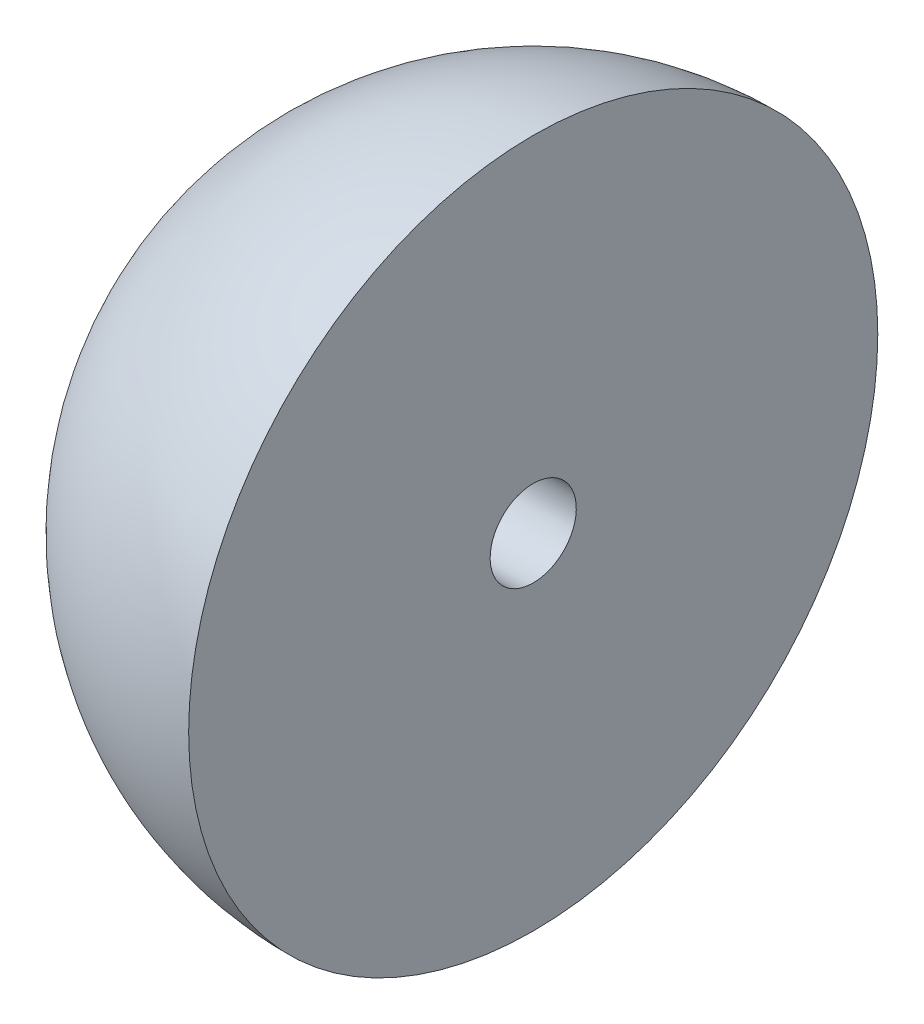
ISO-10303-21;
HEADER;
FILE_DESCRIPTION(('STEP AP214'),'2;1');
FILE_NAME('part.step','',(''),(''),'','','');
FILE_SCHEMA(('AUTOMOTIVE_DESIGN { 1 0 10303 214 1 1 1 1 }'));
ENDSEC;
DATA;
#1=APPLICATION_CONTEXT('core data for automotive mechanical design processes');
#2=APPLICATION_PROTOCOL_DEFINITION('international standard','automotive_design',2000,#1);
#3=PRODUCT_CONTEXT('',#1,'mechanical');
#4=PRODUCT('Part','Part','',(#3));
#5=PRODUCT_RELATED_PRODUCT_CATEGORY('part','',(#4));
#6=PRODUCT_DEFINITION_FORMATION('','',#4);
#7=PRODUCT_DEFINITION_CONTEXT('part definition',#1,'design');
#8=PRODUCT_DEFINITION('design','',#6,#7);
#9=PRODUCT_DEFINITION_SHAPE('','',#8);
#10=(LENGTH_UNIT() NAMED_UNIT(*) SI_UNIT(.MILLI.,.METRE.));
#11=(NAMED_UNIT(*) PLANE_ANGLE_UNIT() SI_UNIT($,.RADIAN.));
#12=(NAMED_UNIT(*) SI_UNIT($,.STERADIAN.) SOLID_ANGLE_UNIT());
#13=UNCERTAINTY_MEASURE_WITH_UNIT(LENGTH_MEASURE(1.E-05),#10,'distance_accuracy_value','');
#14=(GEOMETRIC_REPRESENTATION_CONTEXT(3) GLOBAL_UNCERTAINTY_ASSIGNED_CONTEXT((#13)) GLOBAL_UNIT_ASSIGNED_CONTEXT((#10,
#11,#12)) REPRESENTATION_CONTEXT('',''));
#15=CARTESIAN_POINT('',(0.,0.,0.));
#16=DIRECTION('',(0.,0.,1.));
#17=DIRECTION('',(1.,0.,0.));
#18=AXIS2_PLACEMENT_3D('',#15,#16,#17);
#19=CARTESIAN_POINT('',(0.,0.,0.));
#20=DIRECTION('',(0.,0.,1.));
#21=DIRECTION('',(0.,-1.,0.));
#22=AXIS2_PLACEMENT_3D('',#19,#20,#21);
#23=SPHERICAL_SURFACE('',#22,18.);
#24=CARTESIAN_POINT('',(0.,0.,0.));
#25=DIRECTION('',(-1.,0.,0.));
#26=DIRECTION('',(0.,0.,-1.));
#27=AXIS2_PLACEMENT_3D('',#24,#25,#26);
#28=CIRCLE('',#27,18.);
#29=CARTESIAN_POINT('',(0.,0.,-18.));
#30=VERTEX_POINT('',#29);
#31=EDGE_CURVE('E114',#30,#30,#28,.T.);
#32=ORIENTED_EDGE('',*,*,#31,.T.);
#33=EDGE_LOOP('',(#32));
#34=FACE_BOUND('',#33,.T.);
#35=CARTESIAN_POINT('',(0.,0.,3.5));
#36=DIRECTION('',(0.,0.,-1.));
#37=DIRECTION('',(-1.,0.,0.));
#38=AXIS2_PLACEMENT_3D('',#35,#36,#37);
#39=CIRCLE('',#38,17.6564435830096);
#40=CARTESIAN_POINT('',(-8.64182320352747,-15.3970416547782,3.5));
#41=VERTEX_POINT('',#40);
#42=CARTESIAN_POINT('',(-5.64182320352747,-16.7308048503394,3.5));
#43=VERTEX_POINT('',#42);
#44=EDGE_CURVE('E46',#41,#43,#39,.F.);
#45=ORIENTED_EDGE('',*,*,#44,.T.);
#46=CARTESIAN_POINT('',(-5.64182320352747,0.,0.));
#47=DIRECTION('',(-1.,0.,0.));
#48=DIRECTION('',(0.,0.,1.));
#49=AXIS2_PLACEMENT_3D('',#46,#47,#48);
#50=CIRCLE('',#49,17.0929760703085);
#51=CARTESIAN_POINT('',(-5.64182320352747,-16.7308048503394,-3.5));
#52=VERTEX_POINT('',#51);
#53=EDGE_CURVE('E110',#43,#52,#50,.F.);
#54=ORIENTED_EDGE('',*,*,#53,.T.);
#55=CARTESIAN_POINT('',(0.,0.,-3.5));
#56=DIRECTION('',(0.,0.,1.));
#57=DIRECTION('',(1.,0.,0.));
#58=AXIS2_PLACEMENT_3D('',#55,#56,#57);
#59=CIRCLE('',#58,17.6564435830096);
#60=CARTESIAN_POINT('',(-8.64182320352747,-15.3970416547782,-3.5));
#61=VERTEX_POINT('',#60);
#62=EDGE_CURVE('E11',#52,#61,#59,.F.);
#63=ORIENTED_EDGE('',*,*,#62,.T.);
#64=CARTESIAN_POINT('',(-8.64182320352747,0.,0.));
#65=DIRECTION('',(1.,0.,0.));
#66=DIRECTION('',(0.,0.,-1.));
#67=AXIS2_PLACEMENT_3D('',#64,#65,#66);
#68=CIRCLE('',#67,15.789835075737);
#69=EDGE_CURVE('E98',#61,#41,#68,.F.);
#70=ORIENTED_EDGE('',*,*,#69,.T.);
#71=EDGE_LOOP('',(#45,#54,#63,#70));
#72=FACE_BOUND('',#71,.T.);
#73=ADVANCED_FACE('F39',(#34,#72),#23,.T.);
#74=CARTESIAN_POINT('',(-15.,1.04744440165294E-13,0.));
#75=DIRECTION('',(1.,0.,0.));
#76=DIRECTION('',(0.,1.,0.));
#77=AXIS2_PLACEMENT_3D('',#74,#75,#76);
#78=CYLINDRICAL_SURFACE('',#77,2.25);
#79=CARTESIAN_POINT('',(0.,0.,0.));
#80=DIRECTION('',(1.,0.,0.));
#81=DIRECTION('',(0.,1.,0.));
#82=AXIS2_PLACEMENT_3D('',#79,#80,#81);
#83=CIRCLE('',#82,2.25);
#84=CARTESIAN_POINT('',(0.,2.25,0.));
#85=VERTEX_POINT('',#84);
#86=EDGE_CURVE('E108',#85,#85,#83,.T.);
#87=ORIENTED_EDGE('',*,*,#86,.T.);
#88=EDGE_LOOP('',(#87));
#89=FACE_BOUND('',#88,.T.);
#90=CARTESIAN_POINT('',(-5.64182320352747,0.,0.));
#91=DIRECTION('',(-1.,0.,0.));
#92=DIRECTION('',(0.,0.,1.));
#93=AXIS2_PLACEMENT_3D('',#90,#91,#92);
#94=CIRCLE('',#93,2.25);
#95=CARTESIAN_POINT('',(-5.64182320352747,0.,2.25));
#96=VERTEX_POINT('',#95);
#97=EDGE_CURVE('E106',#96,#96,#94,.F.);
#98=ORIENTED_EDGE('',*,*,#97,.F.);
#99=EDGE_LOOP('',(#98));
#100=FACE_BOUND('',#99,.T.);
#101=ADVANCED_FACE('F136',(#89,#100),#78,.F.);
#102=CARTESIAN_POINT('',(0.,0.,0.));
#103=DIRECTION('',(-1.,0.,0.));
#104=DIRECTION('',(0.,0.,-1.));
#105=AXIS2_PLACEMENT_3D('',#102,#103,#104);
#106=PLANE('',#105);
#107=ORIENTED_EDGE('',*,*,#86,.F.);
#108=EDGE_LOOP('',(#107));
#109=FACE_BOUND('',#108,.T.);
#110=ORIENTED_EDGE('',*,*,#31,.F.);
#111=EDGE_LOOP('',(#110));
#112=FACE_BOUND('',#111,.T.);
#113=ADVANCED_FACE('F149',(#109,#112),#106,.F.);
#114=CARTESIAN_POINT('',(-5.64182320352747,5.,3.5));
#115=DIRECTION('',(-1.,0.,0.));
#116=DIRECTION('',(0.,0.,1.));
#117=AXIS2_PLACEMENT_3D('',#114,#115,#116);
#118=PLANE('',#117);
#119=DIRECTION('',(0.,-1.,0.));
#120=VECTOR('',#119,1.);
#121=CARTESIAN_POINT('',(-5.64182320352747,5.,3.5));
#122=LINE('',#121,#120);
#123=CARTESIAN_POINT('',(-5.64182320352747,5.,3.5));
#124=VERTEX_POINT('',#123);
#125=EDGE_CURVE('E52',#124,#43,#122,.T.);
#126=ORIENTED_EDGE('',*,*,#125,.F.);
#127=DIRECTION('',(0.,0.,-1.));
#128=VECTOR('',#127,1.);
#129=CARTESIAN_POINT('',(-5.64182320352747,5.,3.5));
#130=LINE('',#129,#128);
#131=CARTESIAN_POINT('',(-5.64182320352747,5.,-3.5));
#132=VERTEX_POINT('',#131);
#133=EDGE_CURVE('E82',#124,#132,#130,.T.);
#134=ORIENTED_EDGE('',*,*,#133,.T.);
#135=DIRECTION('',(0.,-1.,0.));
#136=VECTOR('',#135,1.);
#137=CARTESIAN_POINT('',(-5.64182320352747,5.,-3.5));
#138=LINE('',#137,#136);
#139=EDGE_CURVE('E89',#132,#52,#138,.T.);
#140=ORIENTED_EDGE('',*,*,#139,.T.);
#141=ORIENTED_EDGE('',*,*,#53,.F.);
#142=EDGE_LOOP('',(#126,#134,#140,#141));
#143=FACE_BOUND('',#142,.T.);
#144=ORIENTED_EDGE('',*,*,#97,.T.);
#145=EDGE_LOOP('',(#144));
#146=FACE_BOUND('',#145,.T.);
#147=ADVANCED_FACE('F86',(#143,#146),#118,.T.);
#148=CARTESIAN_POINT('',(-8.64182320352747,5.,3.5));
#149=DIRECTION('',(1.,0.,0.));
#150=DIRECTION('',(0.,0.,-1.));
#151=AXIS2_PLACEMENT_3D('',#148,#149,#150);
#152=PLANE('',#151);
#153=DIRECTION('',(0.,-1.,0.));
#154=VECTOR('',#153,1.);
#155=CARTESIAN_POINT('',(-8.64182320352747,5.,-3.5));
#156=LINE('',#155,#154);
#157=CARTESIAN_POINT('',(-8.64182320352747,5.,-3.5));
#158=VERTEX_POINT('',#157);
#159=EDGE_CURVE('E92',#158,#61,#156,.T.);
#160=ORIENTED_EDGE('',*,*,#159,.F.);
#161=DIRECTION('',(0.,0.,1.));
#162=VECTOR('',#161,1.);
#163=CARTESIAN_POINT('',(-8.64182320352747,5.,3.5));
#164=LINE('',#163,#162);
#165=CARTESIAN_POINT('',(-8.64182320352747,5.,3.5));
#166=VERTEX_POINT('',#165);
#167=EDGE_CURVE('E85',#158,#166,#164,.T.);
#168=ORIENTED_EDGE('',*,*,#167,.T.);
#169=DIRECTION('',(0.,-1.,0.));
#170=VECTOR('',#169,1.);
#171=CARTESIAN_POINT('',(-8.64182320352747,5.,3.5));
#172=LINE('',#171,#170);
#173=EDGE_CURVE('E99',#166,#41,#172,.T.);
#174=ORIENTED_EDGE('',*,*,#173,.T.);
#175=ORIENTED_EDGE('',*,*,#69,.F.);
#176=EDGE_LOOP('',(#160,#168,#174,#175));
#177=FACE_BOUND('',#176,.T.);
#178=CARTESIAN_POINT('',(-8.64182320352747,0.,0.));
#179=DIRECTION('',(1.,0.,0.));
#180=DIRECTION('',(0.,0.,-1.));
#181=AXIS2_PLACEMENT_3D('',#178,#179,#180);
#182=CIRCLE('',#181,2.25);
#183=CARTESIAN_POINT('',(-8.64182320352747,0.,-2.25));
#184=VERTEX_POINT('',#183);
#185=EDGE_CURVE('E94',#184,#184,#182,.F.);
#186=ORIENTED_EDGE('',*,*,#185,.T.);
#187=EDGE_LOOP('',(#186));
#188=FACE_BOUND('',#187,.T.);
#189=ADVANCED_FACE('F121',(#177,#188),#152,.T.);
#190=CARTESIAN_POINT('',(-5.64182320352747,5.,-3.5));
#191=DIRECTION('',(0.,0.,1.));
#192=DIRECTION('',(1.,0.,0.));
#193=AXIS2_PLACEMENT_3D('',#190,#191,#192);
#194=PLANE('',#193);
#195=ORIENTED_EDGE('',*,*,#139,.F.);
#196=DIRECTION('',(-1.,0.,0.));
#197=VECTOR('',#196,1.);
#198=CARTESIAN_POINT('',(-5.64182320352747,5.,-3.5));
#199=LINE('',#198,#197);
#200=EDGE_CURVE('E78',#132,#158,#199,.T.);
#201=ORIENTED_EDGE('',*,*,#200,.T.);
#202=ORIENTED_EDGE('',*,*,#159,.T.);
#203=ORIENTED_EDGE('',*,*,#62,.F.);
#204=EDGE_LOOP('',(#195,#201,#202,#203));
#205=FACE_BOUND('',#204,.T.);
#206=ADVANCED_FACE('F91',(#205),#194,.T.);
#207=CARTESIAN_POINT('',(-5.64182320352747,5.,3.5));
#208=DIRECTION('',(0.,0.,-1.));
#209=DIRECTION('',(-1.,0.,0.));
#210=AXIS2_PLACEMENT_3D('',#207,#208,#209);
#211=PLANE('',#210);
#212=ORIENTED_EDGE('',*,*,#173,.F.);
#213=DIRECTION('',(1.,0.,0.));
#214=VECTOR('',#213,1.);
#215=CARTESIAN_POINT('',(-5.64182320352747,5.,3.5));
#216=LINE('',#215,#214);
#217=EDGE_CURVE('E130',#166,#124,#216,.T.);
#218=ORIENTED_EDGE('',*,*,#217,.T.);
#219=ORIENTED_EDGE('',*,*,#125,.T.);
#220=ORIENTED_EDGE('',*,*,#44,.F.);
#221=EDGE_LOOP('',(#212,#218,#219,#220));
#222=FACE_BOUND('',#221,.T.);
#223=ADVANCED_FACE('F122',(#222),#211,.T.);
#224=CARTESIAN_POINT('',(0.,5.,0.));
#225=DIRECTION('',(0.,1.,0.));
#226=DIRECTION('',(0.,0.,1.));
#227=AXIS2_PLACEMENT_3D('',#224,#225,#226);
#228=PLANE('',#227);
#229=ORIENTED_EDGE('',*,*,#133,.F.);
#230=ORIENTED_EDGE('',*,*,#217,.F.);
#231=ORIENTED_EDGE('',*,*,#167,.F.);
#232=ORIENTED_EDGE('',*,*,#200,.F.);
#233=EDGE_LOOP('',(#229,#230,#231,#232));
#234=FACE_BOUND('',#233,.T.);
#235=ADVANCED_FACE('F83',(#234),#228,.F.);
#236=CARTESIAN_POINT('',(-15.,1.04744440165294E-13,0.));
#237=DIRECTION('',(1.,0.,0.));
#238=DIRECTION('',(0.,1.,0.));
#239=AXIS2_PLACEMENT_3D('',#236,#237,#238);
#240=PLANE('',#239);
#241=CARTESIAN_POINT('',(-15.,1.04744440165294E-13,0.));
#242=DIRECTION('',(1.,0.,0.));
#243=DIRECTION('',(0.,1.,0.));
#244=AXIS2_PLACEMENT_3D('',#241,#242,#243);
#245=CIRCLE('',#244,2.25);
#246=CARTESIAN_POINT('',(-15.,2.2500000000001,0.));
#247=VERTEX_POINT('',#246);
#248=EDGE_CURVE('E109',#247,#247,#245,.T.);
#249=ORIENTED_EDGE('',*,*,#248,.T.);
#250=EDGE_LOOP('',(#249));
#251=FACE_BOUND('',#250,.T.);
#252=ADVANCED_FACE('F139',(#251),#240,.T.);
#253=ORIENTED_EDGE('',*,*,#248,.F.);
#254=EDGE_LOOP('',(#253));
#255=FACE_BOUND('',#254,.T.);
#256=ORIENTED_EDGE('',*,*,#185,.F.);
#257=EDGE_LOOP('',(#256));
#258=FACE_BOUND('',#257,.T.);
#259=ADVANCED_FACE('F132',(#255,#258),#78,.F.);
#260=CLOSED_SHELL('',(#73,#101,#113,#147,#189,#206,#223,#235,#252,#259));
#261=MANIFOLD_SOLID_BREP('B2',#260);
#262=ADVANCED_BREP_SHAPE_REPRESENTATION('',(#18,#261),#14);
#263=SHAPE_DEFINITION_REPRESENTATION(#9,#262);
ENDSEC;
END-ISO-10303-21;
